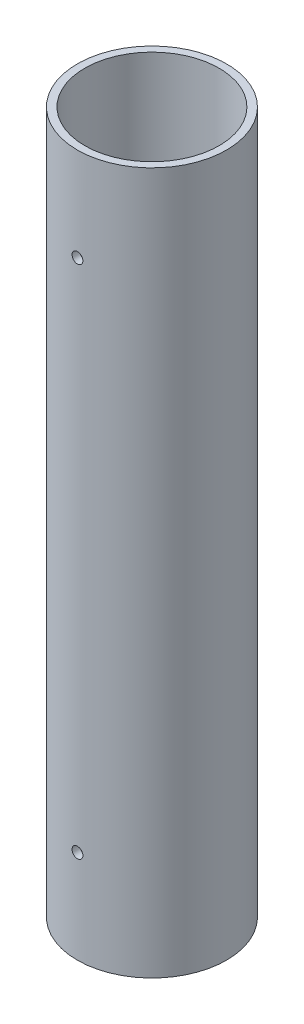
ISO-10303-21;
HEADER;
FILE_DESCRIPTION(('STEP AP214'),'2;1');
FILE_NAME('part.step','',(''),(''),'','','');
FILE_SCHEMA(('AUTOMOTIVE_DESIGN { 1 0 10303 214 1 1 1 1 }'));
ENDSEC;
DATA;
#1=APPLICATION_CONTEXT('core data for automotive mechanical design processes');
#2=APPLICATION_PROTOCOL_DEFINITION('international standard','automotive_design',2000,#1);
#3=PRODUCT_CONTEXT('',#1,'mechanical');
#4=PRODUCT('Part','Part','',(#3));
#5=PRODUCT_RELATED_PRODUCT_CATEGORY('part','',(#4));
#6=PRODUCT_DEFINITION_FORMATION('','',#4);
#7=PRODUCT_DEFINITION_CONTEXT('part definition',#1,'design');
#8=PRODUCT_DEFINITION('design','',#6,#7);
#9=PRODUCT_DEFINITION_SHAPE('','',#8);
#10=(LENGTH_UNIT() NAMED_UNIT(*) SI_UNIT(.MILLI.,.METRE.));
#11=(NAMED_UNIT(*) PLANE_ANGLE_UNIT() SI_UNIT($,.RADIAN.));
#12=(NAMED_UNIT(*) SI_UNIT($,.STERADIAN.) SOLID_ANGLE_UNIT());
#13=UNCERTAINTY_MEASURE_WITH_UNIT(LENGTH_MEASURE(1.E-05),#10,'distance_accuracy_value','');
#14=(GEOMETRIC_REPRESENTATION_CONTEXT(3) GLOBAL_UNCERTAINTY_ASSIGNED_CONTEXT((#13)) GLOBAL_UNIT_ASSIGNED_CONTEXT((#10,
#11,#12)) REPRESENTATION_CONTEXT('',''));
#15=CARTESIAN_POINT('',(0.,0.,0.));
#16=DIRECTION('',(0.,0.,1.));
#17=DIRECTION('',(1.,0.,0.));
#18=AXIS2_PLACEMENT_3D('',#15,#16,#17);
#19=CARTESIAN_POINT('',(0.,188.,0.));
#20=DIRECTION('',(0.,-1.,0.));
#21=DIRECTION('',(0.,0.,-1.));
#22=AXIS2_PLACEMENT_3D('',#19,#20,#21);
#23=CYLINDRICAL_SURFACE('',#22,20.);
#24=CARTESIAN_POINT('',(0.,161.55,20.));
#25=CARTESIAN_POINT('',(-0.0813325379357432,161.55000356746,19.999999305669));
#26=CARTESIAN_POINT('',(-0.162721322543558,161.556866089883,19.9994985780816));
#27=CARTESIAN_POINT('',(-0.323249547463362,161.584142420383,19.9975492174329));
#28=CARTESIAN_POINT('',(-0.40238629139394,161.604571814464,19.9960994941657));
#29=CARTESIAN_POINT('',(-0.55606207799322,161.658390237644,19.9924160662289));
#30=CARTESIAN_POINT('',(-0.630603598887346,161.691772209228,19.9901827885604));
#31=CARTESIAN_POINT('',(-0.773006552482937,161.770536213224,19.9851831076994));
#32=CARTESIAN_POINT('',(-0.840869465473488,161.815915578198,19.98241682305));
#33=CARTESIAN_POINT('',(-0.968140953893573,161.917483150893,19.9766557555265));
#34=CARTESIAN_POINT('',(-1.02753462688634,161.973690011975,19.9736605837825));
#35=CARTESIAN_POINT('',(-1.13605399571014,162.095278069026,19.9677826084771));
#36=CARTESIAN_POINT('',(-1.18517925290133,162.160659656716,19.9648998097201));
#37=CARTESIAN_POINT('',(-1.27181571612739,162.298828827684,19.9595685742205));
#38=CARTESIAN_POINT('',(-1.3093141501408,162.371624439488,19.9571206164003));
#39=CARTESIAN_POINT('',(-1.37155088348087,162.522499133641,19.952940304116));
#40=CARTESIAN_POINT('',(-1.39628935906004,162.600578142994,19.9512079397675));
#41=CARTESIAN_POINT('',(-1.43226155102749,162.759656454672,19.9486579715078));
#42=CARTESIAN_POINT('',(-1.44351913700637,162.840650333061,19.9478387509405));
#43=CARTESIAN_POINT('',(-1.45228369962505,163.003381941553,19.9472026194233));
#44=CARTESIAN_POINT('',(-1.44979087741495,163.085119660758,19.9473856938112));
#45=CARTESIAN_POINT('',(-1.43114515258221,163.246855660954,19.948732007028));
#46=CARTESIAN_POINT('',(-1.41501812814376,163.32685694292,19.9498933889805));
#47=CARTESIAN_POINT('',(-1.36960195468823,163.483014030934,19.9530625291445));
#48=CARTESIAN_POINT('',(-1.3403127046397,163.559169807459,19.9550702938529));
#49=CARTESIAN_POINT('',(-1.26937429476031,163.705556950085,19.9597080940362));
#50=CARTESIAN_POINT('',(-1.22771345303445,163.77578263583,19.9623387171683));
#51=CARTESIAN_POINT('',(-1.13322290115771,163.908254041757,19.9679252381));
#52=CARTESIAN_POINT('',(-1.08039302066776,163.970499640211,19.9708811408601));
#53=CARTESIAN_POINT('',(-0.964918557527601,164.085394467663,19.9767933913192));
#54=CARTESIAN_POINT('',(-0.902251589760686,164.138021202,19.9797497242798));
#55=CARTESIAN_POINT('',(-0.768960141461942,164.232010728043,19.9853231688423));
#56=CARTESIAN_POINT('',(-0.698335657151256,164.273373514399,19.9879402802832));
#57=CARTESIAN_POINT('',(-0.551119864779437,164.343659328103,19.9925407185469));
#58=CARTESIAN_POINT('',(-0.474528117779201,164.372581439319,19.9945239986915));
#59=CARTESIAN_POINT('',(-0.317558324338164,164.417149563524,19.9976327207098));
#60=CARTESIAN_POINT('',(-0.237180337394007,164.432795785056,19.9987581760585));
#61=CARTESIAN_POINT('',(-0.0751147841504789,164.450339971538,20.0000227028329));
#62=CARTESIAN_POINT('',(0.00656940015584837,164.452269024118,20.0001640046604));
#63=CARTESIAN_POINT('',(0.169100103372773,164.442405435217,19.9994502462991));
#64=CARTESIAN_POINT('',(0.249946628169781,164.430612890226,19.9985951931168));
#65=CARTESIAN_POINT('',(0.408419028723604,164.393666605337,19.9959863731517));
#66=CARTESIAN_POINT('',(0.486048262175089,164.368527193698,19.9942335702011));
#67=CARTESIAN_POINT('',(0.635986274527543,164.305615378876,19.990026314159));
#68=CARTESIAN_POINT('',(0.708294989287873,164.267842823427,19.9875718526105));
#69=CARTESIAN_POINT('',(0.845681355219507,164.180658257204,19.9822312187225));
#70=CARTESIAN_POINT('',(0.910745847550366,164.131225558096,19.9793442824137));
#71=CARTESIAN_POINT('',(1.0316641986304,164.022153928316,19.9734659218361));
#72=CARTESIAN_POINT('',(1.08751793604144,163.962514863211,19.9704744961913));
#73=CARTESIAN_POINT('',(1.18853519669872,163.834588962277,19.9647177804832));
#74=CARTESIAN_POINT('',(1.23367849888466,163.766286136581,19.9619529245171));
#75=CARTESIAN_POINT('',(1.31185497563389,163.623051594177,19.9569681447915));
#76=CARTESIAN_POINT('',(1.34488824563242,163.548119929715,19.9547482167375));
#77=CARTESIAN_POINT('',(1.39787219995853,163.393827597718,19.9511068064175));
#78=CARTESIAN_POINT('',(1.41783545596533,163.31447126613,19.9496845570761));
#79=CARTESIAN_POINT('',(1.44415370145261,163.153522390694,19.9477967929303));
#80=CARTESIAN_POINT('',(1.45050888186421,163.071929878238,19.9473312647024));
#81=CARTESIAN_POINT('',(1.44942859099601,162.909025745989,19.947409775376));
#82=CARTESIAN_POINT('',(1.44202489996134,162.827713912426,19.9479514877544));
#83=CARTESIAN_POINT('',(1.41370308990591,162.667491428441,19.9499785043802));
#84=CARTESIAN_POINT('',(1.39278494793185,162.588580782098,19.9514638102302));
#85=CARTESIAN_POINT('',(1.33803561458197,162.435397161109,19.9552100558743));
#86=CARTESIAN_POINT('',(1.30420476757241,162.361124062847,19.9574709749836));
#87=CARTESIAN_POINT('',(1.22459425751693,162.219307167876,19.9625136881115));
#88=CARTESIAN_POINT('',(1.17881484954018,162.15176322756,19.9652954710107));
#89=CARTESIAN_POINT('',(1.07648794724642,162.025159887727,19.9710740344299));
#90=CARTESIAN_POINT('',(1.01991714211675,161.966119350319,19.97407127146));
#91=CARTESIAN_POINT('',(0.897651096724098,161.858350358168,19.9799389408529));
#92=CARTESIAN_POINT('',(0.831953638616724,161.809624417233,19.9828093421695));
#93=CARTESIAN_POINT('',(0.693201645288649,161.723818998491,19.9881038493125));
#94=CARTESIAN_POINT('',(0.620136143622279,161.686757229566,19.9905272742395));
#95=CARTESIAN_POINT('',(0.468853577448974,161.625473916334,19.9946462460027));
#96=CARTESIAN_POINT('',(0.390642616198428,161.601237457427,19.9963426378696));
#97=CARTESIAN_POINT('',(0.25996717765437,161.572535860005,19.9983758686822));
#98=CARTESIAN_POINT('',(0.208345558504369,161.564095974905,19.9989821820119));
#99=CARTESIAN_POINT('',(0.104490365298378,161.552826904244,19.9997944703419));
#100=CARTESIAN_POINT('',(0.0522567924210254,161.549997707879,20.0000004461131));
#101=CARTESIAN_POINT('',(0.,161.55,20.));
#102=B_SPLINE_CURVE_WITH_KNOTS('',3,(#24,#25,#26,#27,#28,#29,#30,#31,#32,#33,#34,#35,#36,#37,
#38,#39,#40,#41,#42,#43,#44,#45,#46,#47,#48,#49,#50,#51,#52,#53,#54,#55,#56,#57,#58,#59,#60,#61,
#62,#63,#64,#65,#66,#67,#68,#69,#70,#71,#72,#73,#74,#75,#76,#77,#78,#79,#80,#81,#82,#83,#84,#85,
#86,#87,#88,#89,#90,#91,#92,#93,#94,#95,#96,#97,#98,#99,#100,#101),.UNSPECIFIED.,.T.,.F.,(4,2,2,
2,2,2,2,2,2,2,2,2,2,2,2,2,2,2,2,2,2,2,2,2,2,2,2,2,2,2,2,2,2,2,2,2,2,2,4),(0.,0.243806834058863,
0.487894245977109,0.731848847543826,0.975749255103617,1.22007366845766,1.46440851657922,
1.70901082241542,1.95360974948472,2.19777494033238,2.44193655937895,2.68563578901932,
2.9293368892938,3.17326884041076,3.4172045120037,3.66170354909414,3.90620270229252,
4.15071985733766,4.39523317134242,4.63919216038104,4.88314943390377,5.12684534002146,
5.37054418349405,5.6146787127274,5.85881645781703,6.10341152547501,6.34800466551725,
6.59236219128795,6.8367162885235,7.08050667798245,7.32429748150249,7.56808178386997,
7.81186088253329,8.05617266402153,8.30054391927817,8.54528441599893,8.78973967418102,
8.94638777562027,9.1030355754013),.UNSPECIFIED.);
#103=CARTESIAN_POINT('',(0.,161.55,20.));
#104=VERTEX_POINT('',#103);
#105=EDGE_CURVE('E10',#104,#104,#102,.T.);
#106=ORIENTED_EDGE('',*,*,#105,.T.);
#107=EDGE_LOOP('',(#106));
#108=FACE_BOUND('',#107,.T.);
#109=CARTESIAN_POINT('',(0.,23.55,20.));
#110=CARTESIAN_POINT('',(-0.0813325379357428,23.5500035674599,19.999999305669));
#111=CARTESIAN_POINT('',(-0.162721322543558,23.5568660898834,19.9994985780816));
#112=CARTESIAN_POINT('',(-0.323249547463361,23.5841424203825,19.9975492174329));
#113=CARTESIAN_POINT('',(-0.40238629139394,23.6045718144645,19.9960994941657));
#114=CARTESIAN_POINT('',(-0.556062077993218,23.6583902376437,19.9924160662289));
#115=CARTESIAN_POINT('',(-0.63060359888734,23.6917722092284,19.9901827885604));
#116=CARTESIAN_POINT('',(-0.773006552482932,23.7705362132235,19.9851831076994));
#117=CARTESIAN_POINT('',(-0.840869465473486,23.8159155781981,19.98241682305));
#118=CARTESIAN_POINT('',(-0.968140953893565,23.9174831508929,19.9766557555265));
#119=CARTESIAN_POINT('',(-1.02753462688633,23.9736900119745,19.9736605837825));
#120=CARTESIAN_POINT('',(-1.13605399571013,24.0952780690258,19.9677826084771));
#121=CARTESIAN_POINT('',(-1.18517925290132,24.1606596567164,19.9648998097201));
#122=CARTESIAN_POINT('',(-1.27181571612738,24.2988288276838,19.9595685742205));
#123=CARTESIAN_POINT('',(-1.30931415014079,24.3716244394877,19.9571206164003));
#124=CARTESIAN_POINT('',(-1.37155088348087,24.5224991336407,19.952940304116));
#125=CARTESIAN_POINT('',(-1.39628935906004,24.6005781429936,19.9512079397675));
#126=CARTESIAN_POINT('',(-1.43226155102749,24.7596564546725,19.9486579715078));
#127=CARTESIAN_POINT('',(-1.44351913700637,24.8406503330607,19.9478387509405));
#128=CARTESIAN_POINT('',(-1.45228369962505,25.0033819415527,19.9472026194233));
#129=CARTESIAN_POINT('',(-1.44979087741495,25.0851196607576,19.9473856938112));
#130=CARTESIAN_POINT('',(-1.43114515258222,25.2468556609538,19.948732007028));
#131=CARTESIAN_POINT('',(-1.41501812814377,25.3268569429199,19.9498933889805));
#132=CARTESIAN_POINT('',(-1.36960195468824,25.4830140309338,19.9530625291445));
#133=CARTESIAN_POINT('',(-1.34031270463971,25.5591698074591,19.9550702938529));
#134=CARTESIAN_POINT('',(-1.26937429476032,25.7055569500848,19.9597080940362));
#135=CARTESIAN_POINT('',(-1.22771345303445,25.7757826358303,19.9623387171683));
#136=CARTESIAN_POINT('',(-1.1332229011577,25.9082540417574,19.9679252381));
#137=CARTESIAN_POINT('',(-1.08039302066775,25.9704996402113,19.9708811408601));
#138=CARTESIAN_POINT('',(-0.964918557527594,26.0853944676632,19.9767933913192));
#139=CARTESIAN_POINT('',(-0.902251589760686,26.1380212020004,19.9797497242798));
#140=CARTESIAN_POINT('',(-0.76896014146195,26.2320107280427,19.9853231688423));
#141=CARTESIAN_POINT('',(-0.698335657151264,26.2733735143989,19.9879402802832));
#142=CARTESIAN_POINT('',(-0.551119864779448,26.3436593281028,19.9925407185469));
#143=CARTESIAN_POINT('',(-0.474528117779214,26.3725814393187,19.9945239986915));
#144=CARTESIAN_POINT('',(-0.317558324338171,26.4171495635239,19.9976327207098));
#145=CARTESIAN_POINT('',(-0.237180337394008,26.4327957850559,19.9987581760585));
#146=CARTESIAN_POINT('',(-0.0751147841504723,26.4503399715381,20.0000227028329));
#147=CARTESIAN_POINT('',(0.0065694001558551,26.4522690241185,20.0001640046603));
#148=CARTESIAN_POINT('',(0.16910010337278,26.4424054352173,19.9994502462991));
#149=CARTESIAN_POINT('',(0.249946628169789,26.4306128902265,19.9985951931168));
#150=CARTESIAN_POINT('',(0.408419028723615,26.3936666053373,19.9959863731517));
#151=CARTESIAN_POINT('',(0.4860482621751,26.3685271936979,19.9942335702011));
#152=CARTESIAN_POINT('',(0.635986274527554,26.3056153788759,19.990026314159));
#153=CARTESIAN_POINT('',(0.708294989287882,26.2678428234269,19.9875718526105));
#154=CARTESIAN_POINT('',(0.845681355219504,26.1806582572042,19.9822312187225));
#155=CARTESIAN_POINT('',(0.910745847550354,26.1312255580962,19.9793442824137));
#156=CARTESIAN_POINT('',(1.03166419863039,26.0221539283158,19.9734659218361));
#157=CARTESIAN_POINT('',(1.08751793604143,25.9625148632106,19.9704744961913));
#158=CARTESIAN_POINT('',(1.18853519669871,25.8345889622765,19.9647177804832));
#159=CARTESIAN_POINT('',(1.23367849888466,25.7662861365806,19.9619529245171));
#160=CARTESIAN_POINT('',(1.3118549756339,25.6230515941773,19.9569681447915));
#161=CARTESIAN_POINT('',(1.34488824563243,25.5481199297154,19.9547482167375));
#162=CARTESIAN_POINT('',(1.39787219995853,25.3938275977178,19.9511068064175));
#163=CARTESIAN_POINT('',(1.41783545596534,25.3144712661303,19.9496845570761));
#164=CARTESIAN_POINT('',(1.44415370145261,25.1535223906944,19.9477967929303));
#165=CARTESIAN_POINT('',(1.45050888186421,25.0719298782375,19.9473312647024));
#166=CARTESIAN_POINT('',(1.44942859099601,24.9090257459885,19.947409775376));
#167=CARTESIAN_POINT('',(1.44202489996134,24.827713912426,19.9479514877544));
#168=CARTESIAN_POINT('',(1.41370308990591,24.6674914284414,19.9499785043802));
#169=CARTESIAN_POINT('',(1.39278494793185,24.5885807820978,19.9514638102302));
#170=CARTESIAN_POINT('',(1.33803561458197,24.4353971611088,19.9552100558743));
#171=CARTESIAN_POINT('',(1.30420476757241,24.3611240628469,19.9574709749836));
#172=CARTESIAN_POINT('',(1.22459425751693,24.2193071678758,19.9625136881115));
#173=CARTESIAN_POINT('',(1.17881484954017,24.15176322756,19.9652954710107));
#174=CARTESIAN_POINT('',(1.07648794724642,24.0251598877266,19.9710740344299));
#175=CARTESIAN_POINT('',(1.01991714211676,23.9661193503189,19.97407127146));
#176=CARTESIAN_POINT('',(0.897651096724103,23.8583503581676,19.9799389408529));
#177=CARTESIAN_POINT('',(0.83195363861672,23.8096244172332,19.9828093421695));
#178=CARTESIAN_POINT('',(0.693201645288639,23.7238189984905,19.9881038493125));
#179=CARTESIAN_POINT('',(0.620136143622273,23.6867572295661,19.9905272742395));
#180=CARTESIAN_POINT('',(0.468853577448971,23.6254739163336,19.9946462460027));
#181=CARTESIAN_POINT('',(0.390642616198424,23.6012374574273,19.9963426378696));
#182=CARTESIAN_POINT('',(0.259967177654365,23.572535860005,19.9983758686822));
#183=CARTESIAN_POINT('',(0.208345558504364,23.5640959749045,19.9989821820119));
#184=CARTESIAN_POINT('',(0.104490365298375,23.5528269042438,19.9997944703419));
#185=CARTESIAN_POINT('',(0.0522567924210239,23.5499977078791,20.0000004461131));
#186=CARTESIAN_POINT('',(0.,23.55,20.));
#187=B_SPLINE_CURVE_WITH_KNOTS('',3,(#109,#110,#111,#112,#113,#114,#115,#116,#117,#118,#119,
#120,#121,#122,#123,#124,#125,#126,#127,#128,#129,#130,#131,#132,#133,#134,#135,#136,#137,#138,
#139,#140,#141,#142,#143,#144,#145,#146,#147,#148,#149,#150,#151,#152,#153,#154,#155,#156,#157,
#158,#159,#160,#161,#162,#163,#164,#165,#166,#167,#168,#169,#170,#171,#172,#173,#174,#175,#176,
#177,#178,#179,#180,#181,#182,#183,#184,#185,#186),.UNSPECIFIED.,.T.,.F.,(4,2,2,2,2,2,2,2,2,2,2,
2,2,2,2,2,2,2,2,2,2,2,2,2,2,2,2,2,2,2,2,2,2,2,2,2,2,2,4),(0.,0.243806834058864,
0.487894245977111,0.731848847543811,0.975749255103612,1.22007366845765,1.4644085165792,
1.7090108224154,1.95360974948475,2.19777494033236,2.44193655937894,2.68563578901932,
2.9293368892938,3.17326884041077,3.41720451200372,3.66170354909415,3.9062027022925,
4.15071985733765,4.39523317134243,4.63919216038104,4.88314943390377,5.12684534002148,
5.37054418349406,5.61467871272736,5.85881645781703,6.10341152547501,6.34800466551726,
6.59236219128797,6.8367162885235,7.08050667798244,7.32429748150248,7.56808178386997,
7.81186088253329,8.05617266402153,8.30054391927818,8.54528441599894,8.78973967418103,
8.94638777562027,9.1030355754013),.UNSPECIFIED.);
#188=CARTESIAN_POINT('',(0.,23.55,20.));
#189=VERTEX_POINT('',#188);
#190=EDGE_CURVE('E42',#189,#189,#187,.T.);
#191=ORIENTED_EDGE('',*,*,#190,.T.);
#192=EDGE_LOOP('',(#191));
#193=FACE_BOUND('',#192,.T.);
#194=CARTESIAN_POINT('',(0.,188.,0.));
#195=DIRECTION('',(0.,1.,0.));
#196=DIRECTION('',(0.,0.,1.));
#197=AXIS2_PLACEMENT_3D('',#194,#195,#196);
#198=CIRCLE('',#197,20.);
#199=CARTESIAN_POINT('',(0.,188.,20.));
#200=VERTEX_POINT('',#199);
#201=EDGE_CURVE('E46',#200,#200,#198,.T.);
#202=ORIENTED_EDGE('',*,*,#201,.F.);
#203=EDGE_LOOP('',(#202));
#204=FACE_BOUND('',#203,.T.);
#205=CARTESIAN_POINT('',(0.,0.,0.));
#206=DIRECTION('',(0.,1.,0.));
#207=DIRECTION('',(0.,0.,1.));
#208=AXIS2_PLACEMENT_3D('',#205,#206,#207);
#209=CIRCLE('',#208,20.);
#210=CARTESIAN_POINT('',(0.,0.,20.));
#211=VERTEX_POINT('',#210);
#212=EDGE_CURVE('E50',#211,#211,#209,.T.);
#213=ORIENTED_EDGE('',*,*,#212,.T.);
#214=EDGE_LOOP('',(#213));
#215=FACE_BOUND('',#214,.T.);
#216=ADVANCED_FACE('F31',(#108,#193,#204,#215),#23,.T.);
#217=CARTESIAN_POINT('',(0.,188.,0.));
#218=DIRECTION('',(0.,1.,0.));
#219=DIRECTION('',(0.,0.,1.));
#220=AXIS2_PLACEMENT_3D('',#217,#218,#219);
#221=PLANE('',#220);
#222=CARTESIAN_POINT('',(0.,188.,0.));
#223=DIRECTION('',(0.,1.,0.));
#224=DIRECTION('',(0.,0.,1.));
#225=AXIS2_PLACEMENT_3D('',#222,#223,#224);
#226=CIRCLE('',#225,18.);
#227=CARTESIAN_POINT('',(0.,188.,18.));
#228=VERTEX_POINT('',#227);
#229=EDGE_CURVE('E78',#228,#228,#226,.T.);
#230=ORIENTED_EDGE('',*,*,#229,.F.);
#231=EDGE_LOOP('',(#230));
#232=FACE_BOUND('',#231,.T.);
#233=ORIENTED_EDGE('',*,*,#201,.T.);
#234=EDGE_LOOP('',(#233));
#235=FACE_BOUND('',#234,.T.);
#236=ADVANCED_FACE('F98',(#232,#235),#221,.T.);
#237=CARTESIAN_POINT('',(0.,0.,0.));
#238=DIRECTION('',(0.,1.,0.));
#239=DIRECTION('',(0.,0.,1.));
#240=AXIS2_PLACEMENT_3D('',#237,#238,#239);
#241=PLANE('',#240);
#242=CARTESIAN_POINT('',(0.,0.,0.));
#243=DIRECTION('',(0.,1.,0.));
#244=DIRECTION('',(0.,0.,1.));
#245=AXIS2_PLACEMENT_3D('',#242,#243,#244);
#246=CIRCLE('',#245,18.);
#247=CARTESIAN_POINT('',(0.,0.,18.));
#248=VERTEX_POINT('',#247);
#249=EDGE_CURVE('E57',#248,#248,#246,.T.);
#250=ORIENTED_EDGE('',*,*,#249,.T.);
#251=EDGE_LOOP('',(#250));
#252=FACE_BOUND('',#251,.T.);
#253=ORIENTED_EDGE('',*,*,#212,.F.);
#254=EDGE_LOOP('',(#253));
#255=FACE_BOUND('',#254,.T.);
#256=ADVANCED_FACE('F90',(#252,#255),#241,.F.);
#257=CARTESIAN_POINT('',(0.,-1.2E-05,0.));
#258=DIRECTION('',(0.,1.,0.));
#259=DIRECTION('',(0.,0.,1.));
#260=AXIS2_PLACEMENT_3D('',#257,#258,#259);
#261=CYLINDRICAL_SURFACE('',#260,18.);
#262=CARTESIAN_POINT('',(0.,161.55,18.));
#263=CARTESIAN_POINT('',(0.0813057244052448,161.55000355541,17.9999992331235));
#264=CARTESIAN_POINT('',(0.16266703530823,161.556861572739,17.9994432394359));
#265=CARTESIAN_POINT('',(0.32313923330735,161.584118963567,17.9972787267626));
#266=CARTESIAN_POINT('',(0.402247453496872,161.604533741345,17.9956690104825));
#267=CARTESIAN_POINT('',(0.555866061478207,161.658311075342,17.9915789878452));
#268=CARTESIAN_POINT('',(0.630378997477261,161.691666379497,17.9890991691808));
#269=CARTESIAN_POINT('',(0.772730391622735,161.770365133309,17.9835471615966));
#270=CARTESIAN_POINT('',(0.840570288185929,161.815705991598,17.9804751007629));
#271=CARTESIAN_POINT('',(0.967830195044949,161.917206070032,17.9740752057116));
#272=CARTESIAN_POINT('',(1.02723205597087,161.973388014381,17.9707468432203));
#273=CARTESIAN_POINT('',(1.13577402557036,162.09492756749,17.9642139150634));
#274=CARTESIAN_POINT('',(1.18491368683791,162.160285576094,17.9610093548003));
#275=CARTESIAN_POINT('',(1.27159720369486,162.298431109155,17.9550811098907));
#276=CARTESIAN_POINT('',(1.30912520357982,162.371228613478,17.9523580849334));
#277=CARTESIAN_POINT('',(1.37141881577643,162.522117077218,17.9477071485473));
#278=CARTESIAN_POINT('',(1.39618464022678,162.600207948621,17.9457792239022));
#279=CARTESIAN_POINT('',(1.43219849169663,162.759285305909,17.9429411328535));
#280=CARTESIAN_POINT('',(1.44347596999468,162.840265084056,17.9420287493588));
#281=CARTESIAN_POINT('',(1.45228397711596,163.002972902953,17.941318005657));
#282=CARTESIAN_POINT('',(1.44981474857681,163.084700930472,17.941519625787));
#283=CARTESIAN_POINT('',(1.43122378745547,163.246383634716,17.9430120970084));
#284=CARTESIAN_POINT('',(1.41513404136938,163.32634201623,17.9443003961118));
#285=CARTESIAN_POINT('',(1.36980845642456,163.48241955802,17.9478170573568));
#286=CARTESIAN_POINT('',(1.34057249656183,163.55853868295,17.9500454281513));
#287=CARTESIAN_POINT('',(1.2697484970522,163.704879030841,17.9551940822217));
#288=CARTESIAN_POINT('',(1.22814608266968,163.775093267445,17.9581151699064));
#289=CARTESIAN_POINT('',(1.13378048356322,163.907554317682,17.964319364817));
#290=CARTESIAN_POINT('',(1.08101708784435,163.969800980655,17.9676024788863));
#291=CARTESIAN_POINT('',(0.965647769682989,164.084745931411,17.9741721426113));
#292=CARTESIAN_POINT('',(0.903014190142211,164.13741646495,17.9774586753362));
#293=CARTESIAN_POINT('',(0.769778999293851,164.231499520343,17.983655920133));
#294=CARTESIAN_POINT('',(0.699177383109479,164.272912035307,17.9865666319749));
#295=CARTESIAN_POINT('',(0.551992379316877,164.343301684101,17.991684773901));
#296=CARTESIAN_POINT('',(0.47540841408256,164.372277615358,17.9938921359685));
#297=CARTESIAN_POINT('',(0.318440815024721,164.41695227862,17.9973540692191));
#298=CARTESIAN_POINT('',(0.238057254917424,164.4326512681,17.9986086588789));
#299=CARTESIAN_POINT('',(0.0760128640783481,164.450291674783,18.0000213153267));
#300=CARTESIAN_POINT('',(-0.00564376726243216,164.452271433326,18.0001824380174));
#301=CARTESIAN_POINT('',(-0.168127799081155,164.44251758191,17.9993981629113));
#302=CARTESIAN_POINT('',(-0.248955206773521,164.43078409136,17.9984527747497));
#303=CARTESIAN_POINT('',(-0.407377270981783,164.393968586266,17.9955637791102));
#304=CARTESIAN_POINT('',(-0.48497607741753,164.368904316471,17.9936214987267));
#305=CARTESIAN_POINT('',(-0.634866674237496,164.306156843871,17.9889569554805));
#306=CARTESIAN_POINT('',(-0.70715838603458,164.268473454249,17.9862346810706));
#307=CARTESIAN_POINT('',(-0.844557346400879,164.181460895416,17.9803078041263));
#308=CARTESIAN_POINT('',(-0.909648443722847,164.132106294708,17.9771021539257));
#309=CARTESIAN_POINT('',(-1.03063550786329,164.023189088116,17.9705722936859));
#310=CARTESIAN_POINT('',(-1.0865313253591,163.963626316494,17.9672480817225));
#311=CARTESIAN_POINT('',(-1.18767242603613,163.835817300799,17.9608467376074));
#312=CARTESIAN_POINT('',(-1.23289271087405,163.767551240716,17.9577701962905));
#313=CARTESIAN_POINT('',(-1.31122776630885,163.624372247692,17.9522207672995));
#314=CARTESIAN_POINT('',(-1.34434265095676,163.549459377383,17.9497478739384));
#315=CARTESIAN_POINT('',(-1.39748420662409,163.395202198276,17.9456889596219));
#316=CARTESIAN_POINT('',(-1.41752624482332,163.315863211974,17.9441018976864));
#317=CARTESIAN_POINT('',(-1.44400324412877,163.154932905116,17.9419907984459));
#318=CARTESIAN_POINT('',(-1.45043844750058,163.073341624686,17.9414667422145));
#319=CARTESIAN_POINT('',(-1.44951638491476,162.910471248934,17.941541241675));
#320=CARTESIAN_POINT('',(-1.44219839943982,162.829191926878,17.9421366002086));
#321=CARTESIAN_POINT('',(-1.41405952813674,162.669020616965,17.9443760565088));
#322=CARTESIAN_POINT('',(-1.39323862103741,162.590128632868,17.9460201559276));
#323=CARTESIAN_POINT('',(-1.33869473840166,162.436968432827,17.9501710085971));
#324=CARTESIAN_POINT('',(-1.30497239792529,162.362699989502,17.9526777193861));
#325=CARTESIAN_POINT('',(-1.22558739983543,162.220872423236,17.9582714064837));
#326=CARTESIAN_POINT('',(-1.17992494776988,162.153313184824,17.961358372803));
#327=CARTESIAN_POINT('',(-1.07780846066203,162.026620907928,17.9677752075631));
#328=CARTESIAN_POINT('',(-1.02132540053363,161.967511296721,17.9711057140695));
#329=CARTESIAN_POINT('',(-0.899222475591328,161.859588370676,17.9776285592224));
#330=CARTESIAN_POINT('',(-0.833600399739302,161.810777554676,17.9808208641875));
#331=CARTESIAN_POINT('',(-0.694963647291083,161.724776871912,17.9867129956322));
#332=CARTESIAN_POINT('',(-0.621936119958496,161.687607680078,17.9894119424344));
#333=CARTESIAN_POINT('',(-0.470705286989422,161.626105890442,17.9940027761805));
#334=CARTESIAN_POINT('',(-0.392508065428127,161.601758495369,17.9958955929713));
#335=CARTESIAN_POINT('',(-0.261539094267248,161.572811355146,17.9981734634594));
#336=CARTESIAN_POINT('',(-0.209610307529556,161.564268420306,17.9988553076251));
#337=CARTESIAN_POINT('',(-0.105128760685817,161.552861600153,17.999768823292));
#338=CARTESIAN_POINT('',(-0.0525760021105315,161.549997700909,18.0000004958974));
#339=CARTESIAN_POINT('',(0.,161.55,18.));
#340=B_SPLINE_CURVE_WITH_KNOTS('',3,(#262,#263,#264,#265,#266,#267,#268,#269,#270,#271,#272,
#273,#274,#275,#276,#277,#278,#279,#280,#281,#282,#283,#284,#285,#286,#287,#288,#289,#290,#291,
#292,#293,#294,#295,#296,#297,#298,#299,#300,#301,#302,#303,#304,#305,#306,#307,#308,#309,#310,
#311,#312,#313,#314,#315,#316,#317,#318,#319,#320,#321,#322,#323,#324,#325,#326,#327,#328,#329,
#330,#331,#332,#333,#334,#335,#336,#337,#338,#339),.UNSPECIFIED.,.T.,.F.,(4,2,2,2,2,2,2,2,2,2,2,
2,2,2,2,2,2,2,2,2,2,2,2,2,2,2,2,2,2,2,2,2,2,2,2,2,2,2,4),(0.,0.243725217325879,
0.487727849770905,0.731593936549533,0.97540734068902,1.21973746996159,1.46407824918856,
1.70875121771917,1.95342011905296,2.19755381437194,2.44168320059842,2.68524085745643,
2.92880075618072,3.17264488285572,3.416493619741,3.66103820640005,3.905582942732,
4.1501513203518,4.39471495502812,4.63859482738116,4.88247257612467,5.12602650594642,
5.36958404157285,5.61367725886906,5.85777443961734,6.10243766293078,6.34709858109051,
6.59147137863173,6.83583982515225,7.07951139142533,7.32318334155604,7.56684329872359,
7.8104990615831,8.05481779481842,8.29919574006541,8.54400525890428,8.78853162741859,
8.94613589285092,9.10373977171985),.UNSPECIFIED.);
#341=CARTESIAN_POINT('',(0.,161.55,18.));
#342=VERTEX_POINT('',#341);
#343=EDGE_CURVE('E79',#342,#342,#340,.T.);
#344=ORIENTED_EDGE('',*,*,#343,.T.);
#345=EDGE_LOOP('',(#344));
#346=FACE_BOUND('',#345,.T.);
#347=CARTESIAN_POINT('',(0.,23.55,18.));
#348=CARTESIAN_POINT('',(0.081305724405248,23.5500035554098,17.9999992331235));
#349=CARTESIAN_POINT('',(0.162667035308234,23.5568615727393,17.9994432394359));
#350=CARTESIAN_POINT('',(0.323139233307356,23.5841189635669,17.9972787267626));
#351=CARTESIAN_POINT('',(0.402247453496878,23.6045337413449,17.9956690104825));
#352=CARTESIAN_POINT('',(0.555866061478206,23.6583110753423,17.9915789878452));
#353=CARTESIAN_POINT('',(0.630378997477254,23.6916663794967,17.9890991691808));
#354=CARTESIAN_POINT('',(0.77273039162273,23.7703651333087,17.9835471615966));
#355=CARTESIAN_POINT('',(0.840570288185932,23.8157059915984,17.9804751007629));
#356=CARTESIAN_POINT('',(0.967830195044953,23.9172060700322,17.9740752057116));
#357=CARTESIAN_POINT('',(1.02723205597087,23.9733880143815,17.9707468432203));
#358=CARTESIAN_POINT('',(1.13577402557035,24.0949275674898,17.9642139150634));
#359=CARTESIAN_POINT('',(1.1849136868379,24.1602855760944,17.9610093548003));
#360=CARTESIAN_POINT('',(1.27159720369485,24.2984311091549,17.9550811098907));
#361=CARTESIAN_POINT('',(1.30912520357981,24.3712286134781,17.9523580849334));
#362=CARTESIAN_POINT('',(1.37141881577642,24.5221170772175,17.9477071485473));
#363=CARTESIAN_POINT('',(1.39618464022677,24.6002079486206,17.9457792239022));
#364=CARTESIAN_POINT('',(1.43219849169662,24.7592853059089,17.9429411328535));
#365=CARTESIAN_POINT('',(1.44347596999468,24.8402650840556,17.9420287493588));
#366=CARTESIAN_POINT('',(1.45228397711596,25.0029729029534,17.941318005657));
#367=CARTESIAN_POINT('',(1.44981474857681,25.0847009304719,17.941519625787));
#368=CARTESIAN_POINT('',(1.43122378745547,25.246383634716,17.9430120970084));
#369=CARTESIAN_POINT('',(1.41513404136938,25.3263420162304,17.9443003961118));
#370=CARTESIAN_POINT('',(1.36980845642455,25.4824195580203,17.9478170573568));
#371=CARTESIAN_POINT('',(1.34057249656182,25.5585386829503,17.9500454281513));
#372=CARTESIAN_POINT('',(1.2697484970522,25.7048790308408,17.9551940822217));
#373=CARTESIAN_POINT('',(1.22814608266968,25.7750932674447,17.9581151699064));
#374=CARTESIAN_POINT('',(1.13378048356322,25.9075543176821,17.964319364817));
#375=CARTESIAN_POINT('',(1.08101708784435,25.9698009806554,17.9676024788863));
#376=CARTESIAN_POINT('',(0.965647769682991,26.0847459314105,17.9741721426113));
#377=CARTESIAN_POINT('',(0.903014190142211,26.1374164649497,17.9774586753362));
#378=CARTESIAN_POINT('',(0.769778999293849,26.2314995203432,17.983655920133));
#379=CARTESIAN_POINT('',(0.699177383109477,26.2729120353069,17.9865666319749));
#380=CARTESIAN_POINT('',(0.551992379316875,26.343301684101,17.991684773901));
#381=CARTESIAN_POINT('',(0.475408414082557,26.3722776153577,17.9938921359685));
#382=CARTESIAN_POINT('',(0.31844081502472,26.4169522786197,17.9973540692191));
#383=CARTESIAN_POINT('',(0.238057254917427,26.4326512681004,17.9986086588789));
#384=CARTESIAN_POINT('',(0.0760128640783536,26.4502916747828,18.0000213153267));
#385=CARTESIAN_POINT('',(-0.00564376726242749,26.4522714333264,18.0001824380174));
#386=CARTESIAN_POINT('',(-0.168127799081153,26.4425175819098,17.9993981629113));
#387=CARTESIAN_POINT('',(-0.24895520677352,26.4307840913602,17.9984527747496));
#388=CARTESIAN_POINT('',(-0.407377270981783,26.393968586266,17.9955637791102));
#389=CARTESIAN_POINT('',(-0.484976077417529,26.3689043164713,17.9936214987267));
#390=CARTESIAN_POINT('',(-0.634866674237493,26.3061568438713,17.9889569554805));
#391=CARTESIAN_POINT('',(-0.707158386034575,26.2684734542488,17.9862346810706));
#392=CARTESIAN_POINT('',(-0.844557346400867,26.1814608954157,17.9803078041263));
#393=CARTESIAN_POINT('',(-0.909648443722831,26.1321062947079,17.9771021539257));
#394=CARTESIAN_POINT('',(-1.03063550786327,26.0231890881164,17.9705722936859));
#395=CARTESIAN_POINT('',(-1.08653132535909,25.9636263164938,17.9672480817225));
#396=CARTESIAN_POINT('',(-1.18767242603613,25.8358173007989,17.9608467376074));
#397=CARTESIAN_POINT('',(-1.23289271087405,25.7675512407158,17.9577701962905));
#398=CARTESIAN_POINT('',(-1.31122776630886,25.6243722476922,17.9522207672995));
#399=CARTESIAN_POINT('',(-1.34434265095676,25.5494593773829,17.9497478739384));
#400=CARTESIAN_POINT('',(-1.39748420662409,25.395202198276,17.9456889596219));
#401=CARTESIAN_POINT('',(-1.41752624482332,25.3158632119744,17.9441018976864));
#402=CARTESIAN_POINT('',(-1.44400324412877,25.1549329051157,17.9419907984459));
#403=CARTESIAN_POINT('',(-1.45043844750058,25.0733416246862,17.9414667422145));
#404=CARTESIAN_POINT('',(-1.44951638491476,24.910471248934,17.941541241675));
#405=CARTESIAN_POINT('',(-1.44219839943982,24.8291919268784,17.9421366002086));
#406=CARTESIAN_POINT('',(-1.41405952813674,24.6690206169649,17.9443760565088));
#407=CARTESIAN_POINT('',(-1.3932386210374,24.590128632868,17.9460201559276));
#408=CARTESIAN_POINT('',(-1.33869473840165,24.4369684328266,17.9501710085971));
#409=CARTESIAN_POINT('',(-1.30497239792528,24.3626999895022,17.9526777193861));
#410=CARTESIAN_POINT('',(-1.22558739983542,24.2208724232362,17.9582714064837));
#411=CARTESIAN_POINT('',(-1.17992494776988,24.153313184824,17.961358372803));
#412=CARTESIAN_POINT('',(-1.07780846066204,24.0266209079284,17.9677752075631));
#413=CARTESIAN_POINT('',(-1.02132540053365,23.967511296721,17.9711057140695));
#414=CARTESIAN_POINT('',(-0.899222475591345,23.8595883706764,17.9776285592224));
#415=CARTESIAN_POINT('',(-0.833600399739313,23.810777554676,17.9808208641875));
#416=CARTESIAN_POINT('',(-0.69496364729109,23.7247768719123,17.9867129956322));
#417=CARTESIAN_POINT('',(-0.621936119958502,23.6876076800777,17.9894119424344));
#418=CARTESIAN_POINT('',(-0.470705286989426,23.6261058904419,17.9940027761805));
#419=CARTESIAN_POINT('',(-0.39250806542813,23.6017584953687,17.9958955929713));
#420=CARTESIAN_POINT('',(-0.261539094267251,23.5728113551456,17.9981734634594));
#421=CARTESIAN_POINT('',(-0.20961030752956,23.5642684203063,17.9988553076251));
#422=CARTESIAN_POINT('',(-0.10512876068582,23.5528616001527,17.999768823292));
#423=CARTESIAN_POINT('',(-0.0525760021105325,23.5499977009093,18.0000004958974));
#424=CARTESIAN_POINT('',(0.,23.55,18.));
#425=B_SPLINE_CURVE_WITH_KNOTS('',3,(#347,#348,#349,#350,#351,#352,#353,#354,#355,#356,#357,
#358,#359,#360,#361,#362,#363,#364,#365,#366,#367,#368,#369,#370,#371,#372,#373,#374,#375,#376,
#377,#378,#379,#380,#381,#382,#383,#384,#385,#386,#387,#388,#389,#390,#391,#392,#393,#394,#395,
#396,#397,#398,#399,#400,#401,#402,#403,#404,#405,#406,#407,#408,#409,#410,#411,#412,#413,#414,
#415,#416,#417,#418,#419,#420,#421,#422,#423,#424),.UNSPECIFIED.,.T.,.F.,(4,2,2,2,2,2,2,2,2,2,2,
2,2,2,2,2,2,2,2,2,2,2,2,2,2,2,2,2,2,2,2,2,2,2,2,2,2,2,4),(0.,0.243725217325887,
0.487727849770902,0.731593936549527,0.975407340689028,1.2197374699616,1.46407824918853,
1.70875121771914,1.95342011905295,2.19755381437193,2.44168320059843,2.68524085745646,
2.9288007561807,3.17264488285573,3.416493619741,3.66103820640005,3.90558294273199,
4.15015132035181,4.39471495502811,4.63859482738116,4.88247257612467,5.12602650594642,
5.36958404157285,5.61367725886903,5.85777443961734,6.10243766293079,6.34709858109051,
6.59147137863174,6.83583982515226,7.07951139142536,7.32318334155609,7.5668432987236,
7.81049906158309,8.0548177948184,8.29919574006539,8.54400525890428,8.78853162741859,
8.94613589285092,9.10373977171986),.UNSPECIFIED.);
#426=CARTESIAN_POINT('',(0.,23.55,18.));
#427=VERTEX_POINT('',#426);
#428=EDGE_CURVE('E71',#427,#427,#425,.T.);
#429=ORIENTED_EDGE('',*,*,#428,.T.);
#430=EDGE_LOOP('',(#429));
#431=FACE_BOUND('',#430,.T.);
#432=ORIENTED_EDGE('',*,*,#229,.T.);
#433=EDGE_LOOP('',(#432));
#434=FACE_BOUND('',#433,.T.);
#435=ORIENTED_EDGE('',*,*,#249,.F.);
#436=EDGE_LOOP('',(#435));
#437=FACE_BOUND('',#436,.T.);
#438=ADVANCED_FACE('F64',(#346,#431,#434,#437),#261,.F.);
#439=CARTESIAN_POINT('',(0.,25.,0.));
#440=DIRECTION('',(0.,0.,-1.));
#441=DIRECTION('',(-1.,0.,0.));
#442=AXIS2_PLACEMENT_3D('',#439,#440,#441);
#443=CYLINDRICAL_SURFACE('',#442,1.44999999999999);
#444=ORIENTED_EDGE('',*,*,#190,.F.);
#445=EDGE_LOOP('',(#444));
#446=FACE_BOUND('',#445,.T.);
#447=ORIENTED_EDGE('',*,*,#428,.F.);
#448=EDGE_LOOP('',(#447));
#449=FACE_BOUND('',#448,.T.);
#450=ADVANCED_FACE('F59',(#446,#449),#443,.F.);
#451=CARTESIAN_POINT('',(0.,163.,0.));
#452=DIRECTION('',(0.,0.,-1.));
#453=DIRECTION('',(-1.,0.,0.));
#454=AXIS2_PLACEMENT_3D('',#451,#452,#453);
#455=CYLINDRICAL_SURFACE('',#454,1.44999999999999);
#456=ORIENTED_EDGE('',*,*,#105,.F.);
#457=EDGE_LOOP('',(#456));
#458=FACE_BOUND('',#457,.T.);
#459=ORIENTED_EDGE('',*,*,#343,.F.);
#460=EDGE_LOOP('',(#459));
#461=FACE_BOUND('',#460,.T.);
#462=ADVANCED_FACE('F63',(#458,#461),#455,.F.);
#463=CLOSED_SHELL('',(#216,#236,#256,#438,#450,#462));
#464=MANIFOLD_SOLID_BREP('B2',#463);
#465=ADVANCED_BREP_SHAPE_REPRESENTATION('',(#18,#464),#14);
#466=SHAPE_DEFINITION_REPRESENTATION(#9,#465);
ENDSEC;
END-ISO-10303-21;
